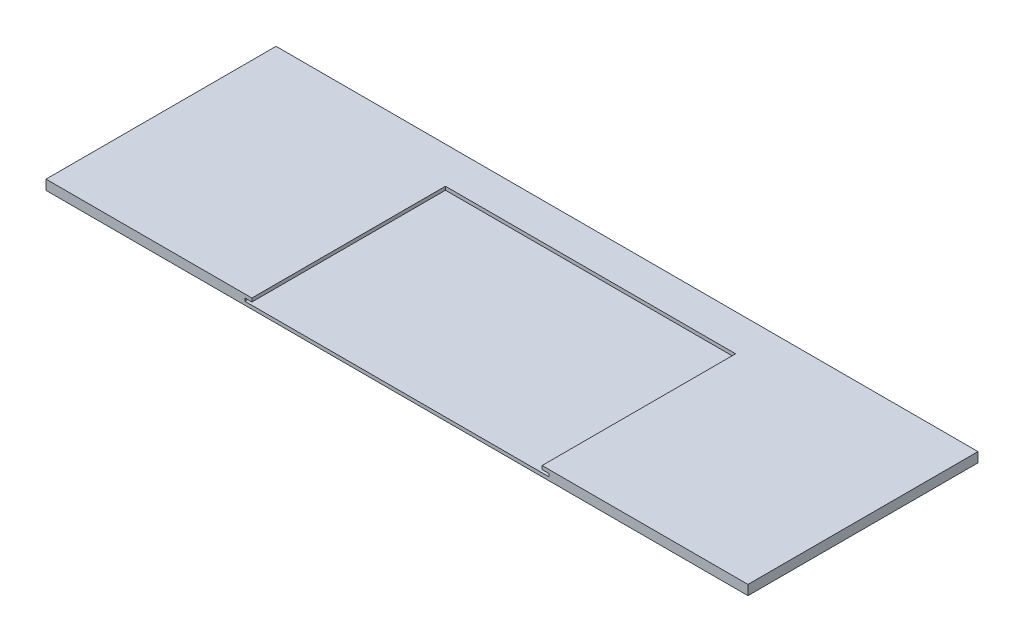
ISO-10303-21;
HEADER;
FILE_DESCRIPTION(('STEP AP214'),'2;1');
FILE_NAME('part.step','',(''),(''),'','','');
FILE_SCHEMA(('AUTOMOTIVE_DESIGN { 1 0 10303 214 1 1 1 1 }'));
ENDSEC;
DATA;
#1=APPLICATION_CONTEXT('core data for automotive mechanical design processes');
#2=APPLICATION_PROTOCOL_DEFINITION('international standard','automotive_design',2000,#1);
#3=PRODUCT_CONTEXT('',#1,'mechanical');
#4=PRODUCT('Part','Part','',(#3));
#5=PRODUCT_RELATED_PRODUCT_CATEGORY('part','',(#4));
#6=PRODUCT_DEFINITION_FORMATION('','',#4);
#7=PRODUCT_DEFINITION_CONTEXT('part definition',#1,'design');
#8=PRODUCT_DEFINITION('design','',#6,#7);
#9=PRODUCT_DEFINITION_SHAPE('','',#8);
#10=(LENGTH_UNIT() NAMED_UNIT(*) SI_UNIT(.MILLI.,.METRE.));
#11=(NAMED_UNIT(*) PLANE_ANGLE_UNIT() SI_UNIT($,.RADIAN.));
#12=(NAMED_UNIT(*) SI_UNIT($,.STERADIAN.) SOLID_ANGLE_UNIT());
#13=UNCERTAINTY_MEASURE_WITH_UNIT(LENGTH_MEASURE(1.E-05),#10,'distance_accuracy_value','');
#14=(GEOMETRIC_REPRESENTATION_CONTEXT(3) GLOBAL_UNCERTAINTY_ASSIGNED_CONTEXT((#13)) GLOBAL_UNIT_ASSIGNED_CONTEXT((#10,
#11,#12)) REPRESENTATION_CONTEXT('',''));
#15=CARTESIAN_POINT('',(0.,0.,0.));
#16=DIRECTION('',(0.,0.,1.));
#17=DIRECTION('',(1.,0.,0.));
#18=AXIS2_PLACEMENT_3D('',#15,#16,#17);
#19=CARTESIAN_POINT('',(43.75,1.81611550102526,0.));
#20=DIRECTION('',(-1.,0.,0.));
#21=DIRECTION('',(0.,0.,1.));
#22=AXIS2_PLACEMENT_3D('',#19,#20,#21);
#23=PLANE('',#22);
#24=DIRECTION('',(0.,-1.,0.));
#25=VECTOR('',#24,1.);
#26=CARTESIAN_POINT('',(43.75,1.81611550102526,33.1));
#27=LINE('',#26,#25);
#28=CARTESIAN_POINT('',(43.75,0.816115501025261,33.1));
#29=VERTEX_POINT('',#28);
#30=CARTESIAN_POINT('',(43.75,0.,33.1));
#31=VERTEX_POINT('',#30);
#32=EDGE_CURVE('E51',#29,#31,#27,.T.);
#33=ORIENTED_EDGE('',*,*,#32,.F.);
#34=DIRECTION('',(0.,0.,-1.));
#35=VECTOR('',#34,1.);
#36=CARTESIAN_POINT('',(43.75,0.816115501025261,33.1));
#37=LINE('',#36,#35);
#38=CARTESIAN_POINT('',(43.75,0.816115501025261,-24.6));
#39=VERTEX_POINT('',#38);
#40=EDGE_CURVE('E161',#29,#39,#37,.T.);
#41=ORIENTED_EDGE('',*,*,#40,.T.);
#42=DIRECTION('',(0.,-1.,0.));
#43=VECTOR('',#42,1.);
#44=CARTESIAN_POINT('',(43.75,1.81611550102526,-24.6));
#45=LINE('',#44,#43);
#46=CARTESIAN_POINT('',(43.75,0.,-24.6));
#47=VERTEX_POINT('',#46);
#48=EDGE_CURVE('E198',#39,#47,#45,.T.);
#49=ORIENTED_EDGE('',*,*,#48,.T.);
#50=DIRECTION('',(0.,0.,-1.));
#51=VECTOR('',#50,1.);
#52=CARTESIAN_POINT('',(43.75,0.,0.));
#53=LINE('',#52,#51);
#54=EDGE_CURVE('E173',#31,#47,#53,.T.);
#55=ORIENTED_EDGE('',*,*,#54,.F.);
#56=EDGE_LOOP('',(#33,#41,#49,#55));
#57=FACE_BOUND('',#56,.T.);
#58=ADVANCED_FACE('F34',(#57),#23,.T.);
#59=CARTESIAN_POINT('',(-43.75,1.81611550102526,0.));
#60=DIRECTION('',(-1.,0.,0.));
#61=DIRECTION('',(0.,0.,1.));
#62=AXIS2_PLACEMENT_3D('',#59,#60,#61);
#63=PLANE('',#62);
#64=DIRECTION('',(0.,0.,1.));
#65=VECTOR('',#64,1.);
#66=CARTESIAN_POINT('',(-43.75,0.816115501025261,-24.6));
#67=LINE('',#66,#65);
#68=CARTESIAN_POINT('',(-43.75,0.816115501025261,-24.6));
#69=VERTEX_POINT('',#68);
#70=CARTESIAN_POINT('',(-43.75,0.816115501025261,33.1));
#71=VERTEX_POINT('',#70);
#72=EDGE_CURVE('E59',#69,#71,#67,.T.);
#73=ORIENTED_EDGE('',*,*,#72,.T.);
#74=DIRECTION('',(0.,-1.,0.));
#75=VECTOR('',#74,1.);
#76=CARTESIAN_POINT('',(-43.75,1.81611550102526,33.1));
#77=LINE('',#76,#75);
#78=CARTESIAN_POINT('',(-43.75,0.,33.1));
#79=VERTEX_POINT('',#78);
#80=EDGE_CURVE('E149',#71,#79,#77,.T.);
#81=ORIENTED_EDGE('',*,*,#80,.T.);
#82=DIRECTION('',(0.,0.,-1.));
#83=VECTOR('',#82,1.);
#84=CARTESIAN_POINT('',(-43.75,0.,0.));
#85=LINE('',#84,#83);
#86=CARTESIAN_POINT('',(-43.75,0.,-24.6));
#87=VERTEX_POINT('',#86);
#88=EDGE_CURVE('E193',#79,#87,#85,.T.);
#89=ORIENTED_EDGE('',*,*,#88,.T.);
#90=DIRECTION('',(0.,-1.,0.));
#91=VECTOR('',#90,1.);
#92=CARTESIAN_POINT('',(-43.75,1.81611550102526,-24.6));
#93=LINE('',#92,#91);
#94=EDGE_CURVE('E200',#69,#87,#93,.T.);
#95=ORIENTED_EDGE('',*,*,#94,.F.);
#96=EDGE_LOOP('',(#73,#81,#89,#95));
#97=FACE_BOUND('',#96,.T.);
#98=ADVANCED_FACE('F244',(#97),#63,.F.);
#99=CARTESIAN_POINT('',(0.,1.81611550102526,-24.6));
#100=DIRECTION('',(0.,0.,-1.));
#101=DIRECTION('',(-1.,0.,0.));
#102=AXIS2_PLACEMENT_3D('',#99,#100,#101);
#103=PLANE('',#102);
#104=DIRECTION('',(-1.,0.,0.));
#105=VECTOR('',#104,1.);
#106=CARTESIAN_POINT('',(43.75,0.816115501025261,-24.6));
#107=LINE('',#106,#105);
#108=EDGE_CURVE('E136',#39,#69,#107,.T.);
#109=ORIENTED_EDGE('',*,*,#108,.T.);
#110=ORIENTED_EDGE('',*,*,#94,.T.);
#111=DIRECTION('',(1.,0.,0.));
#112=VECTOR('',#111,1.);
#113=CARTESIAN_POINT('',(0.,0.,-24.6));
#114=LINE('',#113,#112);
#115=EDGE_CURVE('E181',#87,#47,#114,.T.);
#116=ORIENTED_EDGE('',*,*,#115,.T.);
#117=ORIENTED_EDGE('',*,*,#48,.F.);
#118=EDGE_LOOP('',(#109,#110,#116,#117));
#119=FACE_BOUND('',#118,.T.);
#120=ADVANCED_FACE('F249',(#119),#103,.F.);
#121=CARTESIAN_POINT('',(0.,0.,0.));
#122=DIRECTION('',(0.,1.,0.));
#123=DIRECTION('',(0.,0.,1.));
#124=AXIS2_PLACEMENT_3D('',#121,#122,#123);
#125=PLANE('',#124);
#126=DIRECTION('',(1.,0.,0.));
#127=VECTOR('',#126,1.);
#128=CARTESIAN_POINT('',(0.,0.,33.1));
#129=LINE('',#128,#127);
#130=EDGE_CURVE('E204',#79,#31,#129,.T.);
#131=ORIENTED_EDGE('',*,*,#130,.T.);
#132=ORIENTED_EDGE('',*,*,#54,.T.);
#133=ORIENTED_EDGE('',*,*,#115,.F.);
#134=ORIENTED_EDGE('',*,*,#88,.F.);
#135=EDGE_LOOP('',(#131,#132,#133,#134));
#136=FACE_BOUND('',#135,.T.);
#137=ADVANCED_FACE('F255',(#136),#125,.T.);
#138=CARTESIAN_POINT('',(-101.,-1.,0.));
#139=DIRECTION('',(1.,0.,0.));
#140=DIRECTION('',(0.,0.,-1.));
#141=AXIS2_PLACEMENT_3D('',#138,#139,#140);
#142=PLANE('',#141);
#143=DIRECTION('',(0.,1.,0.));
#144=VECTOR('',#143,1.);
#145=CARTESIAN_POINT('',(-101.,-1.,33.1));
#146=LINE('',#145,#144);
#147=CARTESIAN_POINT('',(-101.,-1.,33.1));
#148=VERTEX_POINT('',#147);
#149=CARTESIAN_POINT('',(-101.,1.81611550102526,33.1));
#150=VERTEX_POINT('',#149);
#151=EDGE_CURVE('E38',#148,#150,#146,.T.);
#152=ORIENTED_EDGE('',*,*,#151,.T.);
#153=DIRECTION('',(0.,0.,-1.));
#154=VECTOR('',#153,1.);
#155=CARTESIAN_POINT('',(-101.,1.81611550102526,0.));
#156=LINE('',#155,#154);
#157=CARTESIAN_POINT('',(-101.,1.81611550102526,-33.1));
#158=VERTEX_POINT('',#157);
#159=EDGE_CURVE('E188',#150,#158,#156,.T.);
#160=ORIENTED_EDGE('',*,*,#159,.T.);
#161=DIRECTION('',(0.,1.,0.));
#162=VECTOR('',#161,1.);
#163=CARTESIAN_POINT('',(-101.,-1.,-33.1));
#164=LINE('',#163,#162);
#165=CARTESIAN_POINT('',(-101.,-1.,-33.1));
#166=VERTEX_POINT('',#165);
#167=EDGE_CURVE('E11',#166,#158,#164,.T.);
#168=ORIENTED_EDGE('',*,*,#167,.F.);
#169=DIRECTION('',(0.,0.,-1.));
#170=VECTOR('',#169,1.);
#171=CARTESIAN_POINT('',(-101.,-1.,0.));
#172=LINE('',#171,#170);
#173=EDGE_CURVE('E205',#148,#166,#172,.T.);
#174=ORIENTED_EDGE('',*,*,#173,.F.);
#175=EDGE_LOOP('',(#152,#160,#168,#174));
#176=FACE_BOUND('',#175,.T.);
#177=ADVANCED_FACE('F36',(#176),#142,.F.);
#178=CARTESIAN_POINT('',(0.,-1.,-33.1));
#179=DIRECTION('',(0.,0.,1.));
#180=DIRECTION('',(1.,0.,0.));
#181=AXIS2_PLACEMENT_3D('',#178,#179,#180);
#182=PLANE('',#181);
#183=ORIENTED_EDGE('',*,*,#167,.T.);
#184=DIRECTION('',(1.,0.,0.));
#185=VECTOR('',#184,1.);
#186=CARTESIAN_POINT('',(0.,1.81611550102526,-33.1));
#187=LINE('',#186,#185);
#188=CARTESIAN_POINT('',(101.,1.81611550102526,-33.1));
#189=VERTEX_POINT('',#188);
#190=EDGE_CURVE('E185',#158,#189,#187,.T.);
#191=ORIENTED_EDGE('',*,*,#190,.T.);
#192=DIRECTION('',(0.,1.,0.));
#193=VECTOR('',#192,1.);
#194=CARTESIAN_POINT('',(101.,-1.,-33.1));
#195=LINE('',#194,#193);
#196=CARTESIAN_POINT('',(101.,-1.,-33.1));
#197=VERTEX_POINT('',#196);
#198=EDGE_CURVE('E43',#197,#189,#195,.T.);
#199=ORIENTED_EDGE('',*,*,#198,.F.);
#200=DIRECTION('',(1.,0.,0.));
#201=VECTOR('',#200,1.);
#202=CARTESIAN_POINT('',(0.,-1.,-33.1));
#203=LINE('',#202,#201);
#204=EDGE_CURVE('E214',#166,#197,#203,.T.);
#205=ORIENTED_EDGE('',*,*,#204,.F.);
#206=EDGE_LOOP('',(#183,#191,#199,#205));
#207=FACE_BOUND('',#206,.T.);
#208=ADVANCED_FACE('F230',(#207),#182,.F.);
#209=CARTESIAN_POINT('',(101.,-1.,0.));
#210=DIRECTION('',(1.,0.,0.));
#211=DIRECTION('',(0.,0.,-1.));
#212=AXIS2_PLACEMENT_3D('',#209,#210,#211);
#213=PLANE('',#212);
#214=ORIENTED_EDGE('',*,*,#198,.T.);
#215=DIRECTION('',(0.,0.,-1.));
#216=VECTOR('',#215,1.);
#217=CARTESIAN_POINT('',(101.,1.81611550102526,0.));
#218=LINE('',#217,#216);
#219=CARTESIAN_POINT('',(101.,1.81611550102526,33.1));
#220=VERTEX_POINT('',#219);
#221=EDGE_CURVE('E180',#220,#189,#218,.T.);
#222=ORIENTED_EDGE('',*,*,#221,.F.);
#223=DIRECTION('',(0.,1.,0.));
#224=VECTOR('',#223,1.);
#225=CARTESIAN_POINT('',(101.,-1.,33.1));
#226=LINE('',#225,#224);
#227=CARTESIAN_POINT('',(101.,-1.,33.1));
#228=VERTEX_POINT('',#227);
#229=EDGE_CURVE('E218',#228,#220,#226,.T.);
#230=ORIENTED_EDGE('',*,*,#229,.F.);
#231=DIRECTION('',(0.,0.,-1.));
#232=VECTOR('',#231,1.);
#233=CARTESIAN_POINT('',(101.,-1.,0.));
#234=LINE('',#233,#232);
#235=EDGE_CURVE('E211',#228,#197,#234,.T.);
#236=ORIENTED_EDGE('',*,*,#235,.T.);
#237=EDGE_LOOP('',(#214,#222,#230,#236));
#238=FACE_BOUND('',#237,.T.);
#239=ADVANCED_FACE('F235',(#238),#213,.T.);
#240=CARTESIAN_POINT('',(0.,-1.,33.1));
#241=DIRECTION('',(0.,0.,1.));
#242=DIRECTION('',(1.,0.,0.));
#243=AXIS2_PLACEMENT_3D('',#240,#241,#242);
#244=PLANE('',#243);
#245=ORIENTED_EDGE('',*,*,#130,.F.);
#246=ORIENTED_EDGE('',*,*,#80,.F.);
#247=DIRECTION('',(1.,0.,0.));
#248=VECTOR('',#247,1.);
#249=CARTESIAN_POINT('',(-43.75,0.816115501025261,33.1));
#250=LINE('',#249,#248);
#251=CARTESIAN_POINT('',(-41.75,0.816115501025261,33.1));
#252=VERTEX_POINT('',#251);
#253=EDGE_CURVE('E142',#71,#252,#250,.T.);
#254=ORIENTED_EDGE('',*,*,#253,.T.);
#255=DIRECTION('',(0.,1.,0.));
#256=VECTOR('',#255,1.);
#257=CARTESIAN_POINT('',(-41.75,0.816115501025261,33.1));
#258=LINE('',#257,#256);
#259=CARTESIAN_POINT('',(-41.75,1.81611550102526,33.1));
#260=VERTEX_POINT('',#259);
#261=EDGE_CURVE('E126',#252,#260,#258,.T.);
#262=ORIENTED_EDGE('',*,*,#261,.T.);
#263=DIRECTION('',(1.,0.,0.));
#264=VECTOR('',#263,1.);
#265=CARTESIAN_POINT('',(0.,1.81611550102526,33.1));
#266=LINE('',#265,#264);
#267=EDGE_CURVE('E182',#150,#260,#266,.T.);
#268=ORIENTED_EDGE('',*,*,#267,.F.);
#269=ORIENTED_EDGE('',*,*,#151,.F.);
#270=DIRECTION('',(1.,0.,0.));
#271=VECTOR('',#270,1.);
#272=CARTESIAN_POINT('',(0.,-1.,33.1));
#273=LINE('',#272,#271);
#274=EDGE_CURVE('E208',#148,#228,#273,.T.);
#275=ORIENTED_EDGE('',*,*,#274,.T.);
#276=ORIENTED_EDGE('',*,*,#229,.T.);
#277=CARTESIAN_POINT('',(41.75,1.81611550102526,33.1));
#278=VERTEX_POINT('',#277);
#279=EDGE_CURVE('E177',#278,#220,#266,.T.);
#280=ORIENTED_EDGE('',*,*,#279,.F.);
#281=DIRECTION('',(0.,1.,0.));
#282=VECTOR('',#281,1.);
#283=CARTESIAN_POINT('',(41.75,0.816115501025261,33.1));
#284=LINE('',#283,#282);
#285=CARTESIAN_POINT('',(41.75,0.816115501025261,33.1));
#286=VERTEX_POINT('',#285);
#287=EDGE_CURVE('E170',#286,#278,#284,.T.);
#288=ORIENTED_EDGE('',*,*,#287,.F.);
#289=DIRECTION('',(1.,0.,0.));
#290=VECTOR('',#289,1.);
#291=CARTESIAN_POINT('',(41.75,0.816115501025261,33.1));
#292=LINE('',#291,#290);
#293=EDGE_CURVE('E158',#286,#29,#292,.T.);
#294=ORIENTED_EDGE('',*,*,#293,.T.);
#295=ORIENTED_EDGE('',*,*,#32,.T.);
#296=EDGE_LOOP('',(#245,#246,#254,#262,#268,#269,#275,#276,#280,#288,#294,#295));
#297=FACE_BOUND('',#296,.T.);
#298=ADVANCED_FACE('F148',(#297),#244,.T.);
#299=CARTESIAN_POINT('',(0.,-1.,0.));
#300=DIRECTION('',(0.,1.,0.));
#301=DIRECTION('',(0.,0.,1.));
#302=AXIS2_PLACEMENT_3D('',#299,#300,#301);
#303=PLANE('',#302);
#304=ORIENTED_EDGE('',*,*,#173,.T.);
#305=ORIENTED_EDGE('',*,*,#204,.T.);
#306=ORIENTED_EDGE('',*,*,#235,.F.);
#307=ORIENTED_EDGE('',*,*,#274,.F.);
#308=EDGE_LOOP('',(#304,#305,#306,#307));
#309=FACE_BOUND('',#308,.T.);
#310=ADVANCED_FACE('F233',(#309),#303,.F.);
#311=CARTESIAN_POINT('',(0.,1.81611550102526,0.));
#312=DIRECTION('',(0.,1.,0.));
#313=DIRECTION('',(0.,0.,1.));
#314=AXIS2_PLACEMENT_3D('',#311,#312,#313);
#315=PLANE('',#314);
#316=ORIENTED_EDGE('',*,*,#267,.T.);
#317=DIRECTION('',(0.,0.,-1.));
#318=VECTOR('',#317,1.);
#319=CARTESIAN_POINT('',(-41.75,1.81611550102526,33.1));
#320=LINE('',#319,#318);
#321=CARTESIAN_POINT('',(-41.75,1.81611550102526,-22.6));
#322=VERTEX_POINT('',#321);
#323=EDGE_CURVE('E131',#260,#322,#320,.T.);
#324=ORIENTED_EDGE('',*,*,#323,.T.);
#325=DIRECTION('',(1.,0.,0.));
#326=VECTOR('',#325,1.);
#327=CARTESIAN_POINT('',(-41.75,1.81611550102526,-22.6));
#328=LINE('',#327,#326);
#329=CARTESIAN_POINT('',(41.75,1.81611550102526,-22.6));
#330=VERTEX_POINT('',#329);
#331=EDGE_CURVE('E165',#322,#330,#328,.T.);
#332=ORIENTED_EDGE('',*,*,#331,.T.);
#333=DIRECTION('',(0.,0.,1.));
#334=VECTOR('',#333,1.);
#335=CARTESIAN_POINT('',(41.75,1.81611550102526,-22.6));
#336=LINE('',#335,#334);
#337=EDGE_CURVE('E151',#330,#278,#336,.T.);
#338=ORIENTED_EDGE('',*,*,#337,.T.);
#339=ORIENTED_EDGE('',*,*,#279,.T.);
#340=ORIENTED_EDGE('',*,*,#221,.T.);
#341=ORIENTED_EDGE('',*,*,#190,.F.);
#342=ORIENTED_EDGE('',*,*,#159,.F.);
#343=EDGE_LOOP('',(#316,#324,#332,#338,#339,#340,#341,#342));
#344=FACE_BOUND('',#343,.T.);
#345=ADVANCED_FACE('F226',(#344),#315,.T.);
#346=CARTESIAN_POINT('',(41.75,0.816115501025261,-22.6));
#347=DIRECTION('',(-1.,0.,0.));
#348=DIRECTION('',(0.,0.,1.));
#349=AXIS2_PLACEMENT_3D('',#346,#347,#348);
#350=PLANE('',#349);
#351=ORIENTED_EDGE('',*,*,#337,.F.);
#352=DIRECTION('',(0.,1.,0.));
#353=VECTOR('',#352,1.);
#354=CARTESIAN_POINT('',(41.75,0.816115501025261,-22.6));
#355=LINE('',#354,#353);
#356=CARTESIAN_POINT('',(41.75,0.816115501025261,-22.6));
#357=VERTEX_POINT('',#356);
#358=EDGE_CURVE('E174',#357,#330,#355,.T.);
#359=ORIENTED_EDGE('',*,*,#358,.F.);
#360=DIRECTION('',(0.,0.,1.));
#361=VECTOR('',#360,1.);
#362=CARTESIAN_POINT('',(41.75,0.816115501025261,-22.6));
#363=LINE('',#362,#361);
#364=EDGE_CURVE('E155',#357,#286,#363,.T.);
#365=ORIENTED_EDGE('',*,*,#364,.T.);
#366=ORIENTED_EDGE('',*,*,#287,.T.);
#367=EDGE_LOOP('',(#351,#359,#365,#366));
#368=FACE_BOUND('',#367,.T.);
#369=ADVANCED_FACE('F270',(#368),#350,.T.);
#370=CARTESIAN_POINT('',(-41.75,0.816115501025261,-22.6));
#371=DIRECTION('',(0.,0.,1.));
#372=DIRECTION('',(1.,0.,0.));
#373=AXIS2_PLACEMENT_3D('',#370,#371,#372);
#374=PLANE('',#373);
#375=ORIENTED_EDGE('',*,*,#331,.F.);
#376=DIRECTION('',(0.,1.,0.));
#377=VECTOR('',#376,1.);
#378=CARTESIAN_POINT('',(-41.75,0.816115501025261,-22.6));
#379=LINE('',#378,#377);
#380=CARTESIAN_POINT('',(-41.75,0.816115501025261,-22.6));
#381=VERTEX_POINT('',#380);
#382=EDGE_CURVE('E135',#381,#322,#379,.T.);
#383=ORIENTED_EDGE('',*,*,#382,.F.);
#384=DIRECTION('',(1.,0.,0.));
#385=VECTOR('',#384,1.);
#386=CARTESIAN_POINT('',(-41.75,0.816115501025261,-22.6));
#387=LINE('',#386,#385);
#388=EDGE_CURVE('E145',#381,#357,#387,.T.);
#389=ORIENTED_EDGE('',*,*,#388,.T.);
#390=ORIENTED_EDGE('',*,*,#358,.T.);
#391=EDGE_LOOP('',(#375,#383,#389,#390));
#392=FACE_BOUND('',#391,.T.);
#393=ADVANCED_FACE('F273',(#392),#374,.T.);
#394=CARTESIAN_POINT('',(-41.75,0.816115501025261,33.1));
#395=DIRECTION('',(1.,0.,0.));
#396=DIRECTION('',(0.,0.,-1.));
#397=AXIS2_PLACEMENT_3D('',#394,#395,#396);
#398=PLANE('',#397);
#399=ORIENTED_EDGE('',*,*,#323,.F.);
#400=ORIENTED_EDGE('',*,*,#261,.F.);
#401=DIRECTION('',(0.,0.,-1.));
#402=VECTOR('',#401,1.);
#403=CARTESIAN_POINT('',(-41.75,0.816115501025261,33.1));
#404=LINE('',#403,#402);
#405=EDGE_CURVE('E129',#252,#381,#404,.T.);
#406=ORIENTED_EDGE('',*,*,#405,.T.);
#407=ORIENTED_EDGE('',*,*,#382,.T.);
#408=EDGE_LOOP('',(#399,#400,#406,#407));
#409=FACE_BOUND('',#408,.T.);
#410=ADVANCED_FACE('F128',(#409),#398,.T.);
#411=CARTESIAN_POINT('',(0.,0.816115501025261,0.));
#412=DIRECTION('',(0.,1.,0.));
#413=DIRECTION('',(0.,0.,1.));
#414=AXIS2_PLACEMENT_3D('',#411,#412,#413);
#415=PLANE('',#414);
#416=ORIENTED_EDGE('',*,*,#72,.F.);
#417=ORIENTED_EDGE('',*,*,#108,.F.);
#418=ORIENTED_EDGE('',*,*,#40,.F.);
#419=ORIENTED_EDGE('',*,*,#293,.F.);
#420=ORIENTED_EDGE('',*,*,#364,.F.);
#421=ORIENTED_EDGE('',*,*,#388,.F.);
#422=ORIENTED_EDGE('',*,*,#405,.F.);
#423=ORIENTED_EDGE('',*,*,#253,.F.);
#424=EDGE_LOOP('',(#416,#417,#418,#419,#420,#421,#422,#423));
#425=FACE_BOUND('',#424,.T.);
#426=ADVANCED_FACE('F141',(#425),#415,.F.);
#427=CLOSED_SHELL('',(#58,#98,#120,#137,#177,#208,#239,#298,#310,#345,#369,#393,#410,#426));
#428=MANIFOLD_SOLID_BREP('B2',#427);
#429=ADVANCED_BREP_SHAPE_REPRESENTATION('',(#18,#428),#14);
#430=SHAPE_DEFINITION_REPRESENTATION(#9,#429);
ENDSEC;
END-ISO-10303-21;
